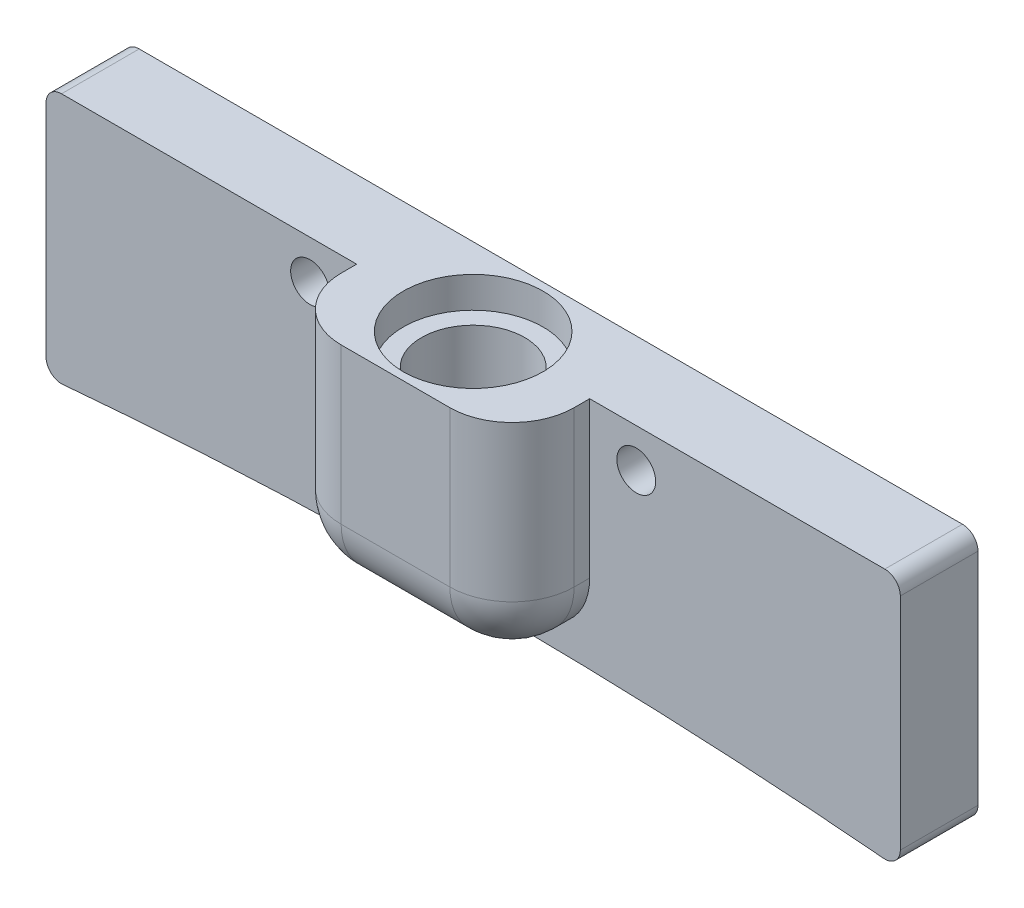
ISO-10303-21;
HEADER;
FILE_DESCRIPTION(('STEP AP214'),'2;1');
FILE_NAME('part.step','',(''),(''),'','','');
FILE_SCHEMA(('AUTOMOTIVE_DESIGN { 1 0 10303 214 1 1 1 1 }'));
ENDSEC;
DATA;
#1=APPLICATION_CONTEXT('core data for automotive mechanical design processes');
#2=APPLICATION_PROTOCOL_DEFINITION('international standard','automotive_design',2000,#1);
#3=PRODUCT_CONTEXT('',#1,'mechanical');
#4=PRODUCT('Part','Part','',(#3));
#5=PRODUCT_RELATED_PRODUCT_CATEGORY('part','',(#4));
#6=PRODUCT_DEFINITION_FORMATION('','',#4);
#7=PRODUCT_DEFINITION_CONTEXT('part definition',#1,'design');
#8=PRODUCT_DEFINITION('design','',#6,#7);
#9=PRODUCT_DEFINITION_SHAPE('','',#8);
#10=(LENGTH_UNIT() NAMED_UNIT(*) SI_UNIT(.MILLI.,.METRE.));
#11=(NAMED_UNIT(*) PLANE_ANGLE_UNIT() SI_UNIT($,.RADIAN.));
#12=(NAMED_UNIT(*) SI_UNIT($,.STERADIAN.) SOLID_ANGLE_UNIT());
#13=UNCERTAINTY_MEASURE_WITH_UNIT(LENGTH_MEASURE(1.E-05),#10,'distance_accuracy_value','');
#14=(GEOMETRIC_REPRESENTATION_CONTEXT(3) GLOBAL_UNCERTAINTY_ASSIGNED_CONTEXT((#13)) GLOBAL_UNIT_ASSIGNED_CONTEXT((#10,
#11,#12)) REPRESENTATION_CONTEXT('',''));
#15=CARTESIAN_POINT('',(0.,0.,0.));
#16=DIRECTION('',(0.,0.,1.));
#17=DIRECTION('',(1.,0.,0.));
#18=AXIS2_PLACEMENT_3D('',#15,#16,#17);
#19=CARTESIAN_POINT('',(-1.09287578986539E-12,-315.000000000012,5.));
#20=DIRECTION('',(0.,0.,-1.));
#21=DIRECTION('',(-1.,0.,0.));
#22=AXIS2_PLACEMENT_3D('',#19,#20,#21);
#23=CYLINDRICAL_SURFACE('',#22,299.999999999988);
#24=CARTESIAN_POINT('',(-1.09287578986539E-12,-315.000000000012,0.));
#25=DIRECTION('',(0.,0.,1.));
#26=DIRECTION('',(1.,0.,0.));
#27=AXIS2_PLACEMENT_3D('',#24,#25,#26);
#28=CIRCLE('',#27,299.999999999988);
#29=CARTESIAN_POINT('',(26.4119601328904,-16.1649144395453,0.));
#30=VERTEX_POINT('',#29);
#31=CARTESIAN_POINT('',(-26.4119602064126,-16.1649144460432,0.));
#32=VERTEX_POINT('',#31);
#33=EDGE_CURVE('E240',#30,#32,#28,.T.);
#34=ORIENTED_EDGE('',*,*,#33,.F.);
#35=DIRECTION('',(0.,0.,-1.));
#36=VECTOR('',#35,1.);
#37=CARTESIAN_POINT('',(26.4119601328904,-16.1649144395453,5.));
#38=LINE('',#37,#36);
#39=CARTESIAN_POINT('',(26.4119601328904,-16.1649144395453,5.));
#40=VERTEX_POINT('',#39);
#41=EDGE_CURVE('E214',#30,#40,#38,.F.);
#42=ORIENTED_EDGE('',*,*,#41,.T.);
#43=CARTESIAN_POINT('',(-1.09287578986539E-12,-315.000000000012,5.));
#44=DIRECTION('',(0.,0.,1.));
#45=DIRECTION('',(1.,0.,0.));
#46=AXIS2_PLACEMENT_3D('',#43,#44,#45);
#47=CIRCLE('',#46,299.999999999988);
#48=CARTESIAN_POINT('',(-26.4119602064126,-16.1649144460432,5.));
#49=VERTEX_POINT('',#48);
#50=EDGE_CURVE('E179',#40,#49,#47,.T.);
#51=ORIENTED_EDGE('',*,*,#50,.T.);
#52=DIRECTION('',(0.,0.,-1.));
#53=VECTOR('',#52,1.);
#54=CARTESIAN_POINT('',(-26.4119602064126,-16.1649144460432,5.));
#55=LINE('',#54,#53);
#56=EDGE_CURVE('E211',#49,#32,#55,.T.);
#57=ORIENTED_EDGE('',*,*,#56,.T.);
#58=EDGE_LOOP('',(#34,#42,#51,#57));
#59=FACE_BOUND('',#58,.T.);
#60=ADVANCED_FACE('F34',(#59),#23,.F.);
#61=CARTESIAN_POINT('',(27.5,0.,5.));
#62=DIRECTION('',(1.,0.,0.));
#63=DIRECTION('',(0.,0.,-1.));
#64=AXIS2_PLACEMENT_3D('',#61,#62,#63);
#65=PLANE('',#64);
#66=DIRECTION('',(0.,-1.,0.));
#67=VECTOR('',#66,1.);
#68=CARTESIAN_POINT('',(27.5,0.,5.));
#69=LINE('',#68,#67);
#70=CARTESIAN_POINT('',(27.5,-1.,5.));
#71=VERTEX_POINT('',#70);
#72=CARTESIAN_POINT('',(27.5,-15.168797487677,5.));
#73=VERTEX_POINT('',#72);
#74=EDGE_CURVE('E200',#71,#73,#69,.T.);
#75=ORIENTED_EDGE('',*,*,#74,.T.);
#76=DIRECTION('',(0.,0.,-1.));
#77=VECTOR('',#76,1.);
#78=CARTESIAN_POINT('',(27.5,-15.168797487677,5.));
#79=LINE('',#78,#77);
#80=CARTESIAN_POINT('',(27.5,-15.168797487677,0.));
#81=VERTEX_POINT('',#80);
#82=EDGE_CURVE('E199',#73,#81,#79,.T.);
#83=ORIENTED_EDGE('',*,*,#82,.T.);
#84=DIRECTION('',(0.,-1.,0.));
#85=VECTOR('',#84,1.);
#86=CARTESIAN_POINT('',(27.5,0.,0.));
#87=LINE('',#86,#85);
#88=CARTESIAN_POINT('',(27.5,-1.,0.));
#89=VERTEX_POINT('',#88);
#90=EDGE_CURVE('E231',#89,#81,#87,.T.);
#91=ORIENTED_EDGE('',*,*,#90,.F.);
#92=DIRECTION('',(0.,0.,-1.));
#93=VECTOR('',#92,1.);
#94=CARTESIAN_POINT('',(27.5,-1.,5.));
#95=LINE('',#94,#93);
#96=EDGE_CURVE('E197',#89,#71,#95,.F.);
#97=ORIENTED_EDGE('',*,*,#96,.T.);
#98=EDGE_LOOP('',(#75,#83,#91,#97));
#99=FACE_BOUND('',#98,.T.);
#100=ADVANCED_FACE('F388',(#99),#65,.T.);
#101=CARTESIAN_POINT('',(-27.5000000737673,0.,5.));
#102=DIRECTION('',(0.,1.,0.));
#103=DIRECTION('',(-1.,0.,0.));
#104=AXIS2_PLACEMENT_3D('',#101,#102,#103);
#105=PLANE('',#104);
#106=CARTESIAN_POINT('',(0.,0.,5.));
#107=DIRECTION('',(0.,1.,0.));
#108=DIRECTION('',(0.,0.,1.));
#109=AXIS2_PLACEMENT_3D('',#106,#107,#108);
#110=CIRCLE('',#109,4.49999999999999);
#111=CARTESIAN_POINT('',(0.,0.,9.49999999999999));
#112=VERTEX_POINT('',#111);
#113=EDGE_CURVE('E276',#112,#112,#110,.T.);
#114=ORIENTED_EDGE('',*,*,#113,.F.);
#115=EDGE_LOOP('',(#114));
#116=FACE_BOUND('',#115,.T.);
#117=DIRECTION('',(-1.,0.,0.));
#118=VECTOR('',#117,1.);
#119=CARTESIAN_POINT('',(-7.5,0.,10.));
#120=LINE('',#119,#118);
#121=CARTESIAN_POINT('',(3.5,0.,10.));
#122=VERTEX_POINT('',#121);
#123=CARTESIAN_POINT('',(-3.5,0.,10.));
#124=VERTEX_POINT('',#123);
#125=EDGE_CURVE('E170',#122,#124,#120,.T.);
#126=ORIENTED_EDGE('',*,*,#125,.F.);
#127=CARTESIAN_POINT('',(3.5,0.,6.));
#128=DIRECTION('',(0.,1.,0.));
#129=DIRECTION('',(-1.,0.,0.));
#130=AXIS2_PLACEMENT_3D('',#127,#128,#129);
#131=CIRCLE('',#130,4.);
#132=CARTESIAN_POINT('',(7.5,0.,6.));
#133=VERTEX_POINT('',#132);
#134=EDGE_CURVE('E252',#122,#133,#131,.T.);
#135=ORIENTED_EDGE('',*,*,#134,.T.);
#136=DIRECTION('',(0.,0.,-1.));
#137=VECTOR('',#136,1.);
#138=CARTESIAN_POINT('',(7.5,0.,10.));
#139=LINE('',#138,#137);
#140=CARTESIAN_POINT('',(7.5,0.,5.));
#141=VERTEX_POINT('',#140);
#142=EDGE_CURVE('E173',#133,#141,#139,.T.);
#143=ORIENTED_EDGE('',*,*,#142,.T.);
#144=DIRECTION('',(1.,0.,0.));
#145=VECTOR('',#144,1.);
#146=CARTESIAN_POINT('',(-27.5000000737673,0.,5.));
#147=LINE('',#146,#145);
#148=CARTESIAN_POINT('',(26.5,0.,5.));
#149=VERTEX_POINT('',#148);
#150=EDGE_CURVE('E221',#141,#149,#147,.T.);
#151=ORIENTED_EDGE('',*,*,#150,.T.);
#152=DIRECTION('',(0.,0.,-1.));
#153=VECTOR('',#152,1.);
#154=CARTESIAN_POINT('',(26.5,0.,5.));
#155=LINE('',#154,#153);
#156=CARTESIAN_POINT('',(26.5,0.,0.));
#157=VERTEX_POINT('',#156);
#158=EDGE_CURVE('E185',#149,#157,#155,.T.);
#159=ORIENTED_EDGE('',*,*,#158,.T.);
#160=DIRECTION('',(1.,0.,0.));
#161=VECTOR('',#160,1.);
#162=CARTESIAN_POINT('',(-27.5000000737673,0.,0.));
#163=LINE('',#162,#161);
#164=CARTESIAN_POINT('',(-26.5000000737673,0.,0.));
#165=VERTEX_POINT('',#164);
#166=EDGE_CURVE('E235',#165,#157,#163,.T.);
#167=ORIENTED_EDGE('',*,*,#166,.F.);
#168=DIRECTION('',(0.,0.,-1.));
#169=VECTOR('',#168,1.);
#170=CARTESIAN_POINT('',(-26.5000000737673,0.,5.));
#171=LINE('',#170,#169);
#172=CARTESIAN_POINT('',(-26.5000000737673,0.,5.));
#173=VERTEX_POINT('',#172);
#174=EDGE_CURVE('E328',#165,#173,#171,.F.);
#175=ORIENTED_EDGE('',*,*,#174,.T.);
#176=CARTESIAN_POINT('',(-7.5,0.,5.));
#177=VERTEX_POINT('',#176);
#178=EDGE_CURVE('E217',#173,#177,#147,.T.);
#179=ORIENTED_EDGE('',*,*,#178,.T.);
#180=DIRECTION('',(0.,0.,-1.));
#181=VECTOR('',#180,1.);
#182=CARTESIAN_POINT('',(-7.5,0.,10.));
#183=LINE('',#182,#181);
#184=CARTESIAN_POINT('',(-7.5,0.,6.));
#185=VERTEX_POINT('',#184);
#186=EDGE_CURVE('E189',#185,#177,#183,.T.);
#187=ORIENTED_EDGE('',*,*,#186,.F.);
#188=CARTESIAN_POINT('',(-3.5,0.,6.));
#189=DIRECTION('',(0.,1.,0.));
#190=DIRECTION('',(-1.,0.,0.));
#191=AXIS2_PLACEMENT_3D('',#188,#189,#190);
#192=CIRCLE('',#191,4.);
#193=EDGE_CURVE('E250',#185,#124,#192,.T.);
#194=ORIENTED_EDGE('',*,*,#193,.T.);
#195=EDGE_LOOP('',(#126,#135,#143,#151,#159,#167,#175,#179,#187,#194));
#196=FACE_BOUND('',#195,.T.);
#197=ADVANCED_FACE('F360',(#116,#196),#105,.T.);
#198=CARTESIAN_POINT('',(-27.5000000737673,-16.2630756067663,5.));
#199=DIRECTION('',(-1.,0.,0.));
#200=DIRECTION('',(0.,0.,1.));
#201=AXIS2_PLACEMENT_3D('',#198,#199,#200);
#202=PLANE('',#201);
#203=DIRECTION('',(0.,1.,0.));
#204=VECTOR('',#203,1.);
#205=CARTESIAN_POINT('',(-27.5000000737673,-16.2630756067663,0.));
#206=LINE('',#205,#204);
#207=CARTESIAN_POINT('',(-27.5000000737673,-15.1687974941966,0.));
#208=VERTEX_POINT('',#207);
#209=CARTESIAN_POINT('',(-27.5000000737673,-0.999999999999994,0.));
#210=VERTEX_POINT('',#209);
#211=EDGE_CURVE('E238',#208,#210,#206,.T.);
#212=ORIENTED_EDGE('',*,*,#211,.F.);
#213=DIRECTION('',(0.,0.,-1.));
#214=VECTOR('',#213,1.);
#215=CARTESIAN_POINT('',(-27.5000000737673,-15.1687974941966,5.));
#216=LINE('',#215,#214);
#217=CARTESIAN_POINT('',(-27.5000000737673,-15.1687974941966,5.));
#218=VERTEX_POINT('',#217);
#219=EDGE_CURVE('E323',#208,#218,#216,.F.);
#220=ORIENTED_EDGE('',*,*,#219,.T.);
#221=DIRECTION('',(0.,1.,0.));
#222=VECTOR('',#221,1.);
#223=CARTESIAN_POINT('',(-27.5000000737673,-16.2630756067663,5.));
#224=LINE('',#223,#222);
#225=CARTESIAN_POINT('',(-27.5000000737673,-0.999999999999994,5.));
#226=VERTEX_POINT('',#225);
#227=EDGE_CURVE('E225',#218,#226,#224,.T.);
#228=ORIENTED_EDGE('',*,*,#227,.T.);
#229=DIRECTION('',(0.,0.,-1.));
#230=VECTOR('',#229,1.);
#231=CARTESIAN_POINT('',(-27.5000000737673,-0.999999999999994,5.));
#232=LINE('',#231,#230);
#233=EDGE_CURVE('E320',#226,#210,#232,.T.);
#234=ORIENTED_EDGE('',*,*,#233,.T.);
#235=EDGE_LOOP('',(#212,#220,#228,#234));
#236=FACE_BOUND('',#235,.T.);
#237=ADVANCED_FACE('F302',(#236),#202,.T.);
#238=CARTESIAN_POINT('',(-1.09287578986539E-12,-315.000000000012,5.));
#239=DIRECTION('',(0.,0.,1.));
#240=DIRECTION('',(1.,0.,0.));
#241=AXIS2_PLACEMENT_3D('',#238,#239,#240);
#242=PLANE('',#241);
#243=CARTESIAN_POINT('',(-10.5,-2.5,5.));
#244=DIRECTION('',(0.,0.,1.));
#245=DIRECTION('',(1.,0.,0.));
#246=AXIS2_PLACEMENT_3D('',#243,#244,#245);
#247=CIRCLE('',#246,1.25);
#248=CARTESIAN_POINT('',(-9.25,-2.5,5.));
#249=VERTEX_POINT('',#248);
#250=EDGE_CURVE('E292',#249,#249,#247,.T.);
#251=ORIENTED_EDGE('',*,*,#250,.F.);
#252=EDGE_LOOP('',(#251));
#253=FACE_BOUND('',#252,.T.);
#254=CARTESIAN_POINT('',(10.5,-2.5,5.));
#255=DIRECTION('',(0.,0.,1.));
#256=DIRECTION('',(1.,0.,0.));
#257=AXIS2_PLACEMENT_3D('',#254,#255,#256);
#258=CIRCLE('',#257,1.25);
#259=CARTESIAN_POINT('',(11.75,-2.5,5.));
#260=VERTEX_POINT('',#259);
#261=EDGE_CURVE('E286',#260,#260,#258,.T.);
#262=ORIENTED_EDGE('',*,*,#261,.F.);
#263=EDGE_LOOP('',(#262));
#264=FACE_BOUND('',#263,.T.);
#265=ORIENTED_EDGE('',*,*,#50,.F.);
#266=CARTESIAN_POINT('',(26.5,-15.168797487677,5.));
#267=DIRECTION('',(0.,0.,1.));
#268=DIRECTION('',(1.,0.,0.));
#269=AXIS2_PLACEMENT_3D('',#266,#267,#268);
#270=CIRCLE('',#269,1.);
#271=EDGE_CURVE('E309',#40,#73,#270,.T.);
#272=ORIENTED_EDGE('',*,*,#271,.T.);
#273=ORIENTED_EDGE('',*,*,#74,.F.);
#274=CARTESIAN_POINT('',(26.5,-1.,5.));
#275=DIRECTION('',(0.,0.,1.));
#276=DIRECTION('',(1.,0.,0.));
#277=AXIS2_PLACEMENT_3D('',#274,#275,#276);
#278=CIRCLE('',#277,1.);
#279=EDGE_CURVE('E325',#71,#149,#278,.T.);
#280=ORIENTED_EDGE('',*,*,#279,.T.);
#281=ORIENTED_EDGE('',*,*,#150,.F.);
#282=DIRECTION('',(0.,1.,0.));
#283=VECTOR('',#282,1.);
#284=CARTESIAN_POINT('',(7.5,0.,5.));
#285=LINE('',#284,#283);
#286=CARTESIAN_POINT('',(7.5,-10.,5.));
#287=VERTEX_POINT('',#286);
#288=EDGE_CURVE('E174',#287,#141,#285,.T.);
#289=ORIENTED_EDGE('',*,*,#288,.F.);
#290=CARTESIAN_POINT('',(3.5,-10.,5.));
#291=DIRECTION('',(0.,0.,1.));
#292=DIRECTION('',(1.,0.,0.));
#293=AXIS2_PLACEMENT_3D('',#290,#291,#292);
#294=CIRCLE('',#293,4.);
#295=CARTESIAN_POINT('',(3.5,-14.,5.));
#296=VERTEX_POINT('',#295);
#297=EDGE_CURVE('E43',#287,#296,#294,.F.);
#298=ORIENTED_EDGE('',*,*,#297,.T.);
#299=DIRECTION('',(1.,0.,0.));
#300=VECTOR('',#299,1.);
#301=CARTESIAN_POINT('',(7.5,-14.,5.));
#302=LINE('',#301,#300);
#303=CARTESIAN_POINT('',(-3.5,-14.,5.));
#304=VERTEX_POINT('',#303);
#305=EDGE_CURVE('E163',#304,#296,#302,.T.);
#306=ORIENTED_EDGE('',*,*,#305,.F.);
#307=CARTESIAN_POINT('',(-3.5,-10.,5.));
#308=DIRECTION('',(0.,0.,1.));
#309=DIRECTION('',(1.,0.,0.));
#310=AXIS2_PLACEMENT_3D('',#307,#308,#309);
#311=CIRCLE('',#310,4.);
#312=CARTESIAN_POINT('',(-7.5,-10.,5.));
#313=VERTEX_POINT('',#312);
#314=EDGE_CURVE('E11',#304,#313,#311,.F.);
#315=ORIENTED_EDGE('',*,*,#314,.T.);
#316=DIRECTION('',(0.,-1.,0.));
#317=VECTOR('',#316,1.);
#318=CARTESIAN_POINT('',(-7.5,-14.,5.));
#319=LINE('',#318,#317);
#320=EDGE_CURVE('E160',#177,#313,#319,.T.);
#321=ORIENTED_EDGE('',*,*,#320,.F.);
#322=ORIENTED_EDGE('',*,*,#178,.F.);
#323=CARTESIAN_POINT('',(-26.5000000737673,-0.999999999999994,5.));
#324=DIRECTION('',(0.,0.,1.));
#325=DIRECTION('',(1.,0.,0.));
#326=AXIS2_PLACEMENT_3D('',#323,#324,#325);
#327=CIRCLE('',#326,1.);
#328=EDGE_CURVE('E216',#173,#226,#327,.T.);
#329=ORIENTED_EDGE('',*,*,#328,.T.);
#330=ORIENTED_EDGE('',*,*,#227,.F.);
#331=CARTESIAN_POINT('',(-26.5000000737673,-15.1687974941966,5.));
#332=DIRECTION('',(0.,0.,1.));
#333=DIRECTION('',(1.,0.,0.));
#334=AXIS2_PLACEMENT_3D('',#331,#332,#333);
#335=CIRCLE('',#334,1.);
#336=EDGE_CURVE('E313',#218,#49,#335,.T.);
#337=ORIENTED_EDGE('',*,*,#336,.T.);
#338=EDGE_LOOP('',(#265,#272,#273,#280,#281,#289,#298,#306,#315,#321,#322,#329,#330,#337));
#339=FACE_BOUND('',#338,.T.);
#340=ADVANCED_FACE('F298',(#253,#264,#339),#242,.T.);
#341=CARTESIAN_POINT('',(-1.09287578986539E-12,-315.000000000012,0.));
#342=DIRECTION('',(0.,0.,1.));
#343=DIRECTION('',(1.,0.,0.));
#344=AXIS2_PLACEMENT_3D('',#341,#342,#343);
#345=PLANE('',#344);
#346=CARTESIAN_POINT('',(-10.5,-2.5,0.));
#347=DIRECTION('',(0.,0.,1.));
#348=DIRECTION('',(1.,0.,0.));
#349=AXIS2_PLACEMENT_3D('',#346,#347,#348);
#350=CIRCLE('',#349,1.25);
#351=CARTESIAN_POINT('',(-9.25,-2.5,0.));
#352=VERTEX_POINT('',#351);
#353=EDGE_CURVE('E289',#352,#352,#350,.T.);
#354=ORIENTED_EDGE('',*,*,#353,.T.);
#355=EDGE_LOOP('',(#354));
#356=FACE_BOUND('',#355,.T.);
#357=CARTESIAN_POINT('',(10.5,-2.5,0.));
#358=DIRECTION('',(0.,0.,1.));
#359=DIRECTION('',(1.,0.,0.));
#360=AXIS2_PLACEMENT_3D('',#357,#358,#359);
#361=CIRCLE('',#360,1.25);
#362=CARTESIAN_POINT('',(11.75,-2.5,0.));
#363=VERTEX_POINT('',#362);
#364=EDGE_CURVE('E262',#363,#363,#361,.T.);
#365=ORIENTED_EDGE('',*,*,#364,.T.);
#366=EDGE_LOOP('',(#365));
#367=FACE_BOUND('',#366,.T.);
#368=ORIENTED_EDGE('',*,*,#90,.T.);
#369=CARTESIAN_POINT('',(26.5,-15.168797487677,0.));
#370=DIRECTION('',(0.,0.,1.));
#371=DIRECTION('',(1.,0.,0.));
#372=AXIS2_PLACEMENT_3D('',#369,#370,#371);
#373=CIRCLE('',#372,1.);
#374=EDGE_CURVE('E209',#81,#30,#373,.F.);
#375=ORIENTED_EDGE('',*,*,#374,.T.);
#376=ORIENTED_EDGE('',*,*,#33,.T.);
#377=CARTESIAN_POINT('',(-26.5000000737673,-15.1687974941966,0.));
#378=DIRECTION('',(0.,0.,1.));
#379=DIRECTION('',(1.,0.,0.));
#380=AXIS2_PLACEMENT_3D('',#377,#378,#379);
#381=CIRCLE('',#380,1.);
#382=EDGE_CURVE('E207',#32,#208,#381,.F.);
#383=ORIENTED_EDGE('',*,*,#382,.T.);
#384=ORIENTED_EDGE('',*,*,#211,.T.);
#385=CARTESIAN_POINT('',(-26.5000000737673,-0.999999999999994,0.));
#386=DIRECTION('',(0.,0.,1.));
#387=DIRECTION('',(1.,0.,0.));
#388=AXIS2_PLACEMENT_3D('',#385,#386,#387);
#389=CIRCLE('',#388,1.);
#390=EDGE_CURVE('E203',#210,#165,#389,.F.);
#391=ORIENTED_EDGE('',*,*,#390,.T.);
#392=ORIENTED_EDGE('',*,*,#166,.T.);
#393=CARTESIAN_POINT('',(26.5,-1.,0.));
#394=DIRECTION('',(0.,0.,1.));
#395=DIRECTION('',(1.,0.,0.));
#396=AXIS2_PLACEMENT_3D('',#393,#394,#395);
#397=CIRCLE('',#396,1.);
#398=EDGE_CURVE('E205',#157,#89,#397,.F.);
#399=ORIENTED_EDGE('',*,*,#398,.T.);
#400=EDGE_LOOP('',(#368,#375,#376,#383,#384,#391,#392,#399));
#401=FACE_BOUND('',#400,.T.);
#402=ADVANCED_FACE('F301',(#356,#367,#401),#345,.F.);
#403=CARTESIAN_POINT('',(-7.5,-14.,10.));
#404=DIRECTION('',(1.,0.,0.));
#405=DIRECTION('',(0.,1.,0.));
#406=AXIS2_PLACEMENT_3D('',#403,#404,#405);
#407=PLANE('',#406);
#408=ORIENTED_EDGE('',*,*,#320,.T.);
#409=DIRECTION('',(0.,0.,-1.));
#410=VECTOR('',#409,1.);
#411=CARTESIAN_POINT('',(-7.5,-10.,10.));
#412=LINE('',#411,#410);
#413=CARTESIAN_POINT('',(-7.5,-10.,6.));
#414=VERTEX_POINT('',#413);
#415=EDGE_CURVE('E51',#313,#414,#412,.F.);
#416=ORIENTED_EDGE('',*,*,#415,.T.);
#417=DIRECTION('',(0.,-1.,0.));
#418=VECTOR('',#417,1.);
#419=CARTESIAN_POINT('',(-7.5,-14.,6.));
#420=LINE('',#419,#418);
#421=EDGE_CURVE('E254',#414,#185,#420,.F.);
#422=ORIENTED_EDGE('',*,*,#421,.T.);
#423=ORIENTED_EDGE('',*,*,#186,.T.);
#424=EDGE_LOOP('',(#408,#416,#422,#423));
#425=FACE_BOUND('',#424,.T.);
#426=ADVANCED_FACE('F553',(#425),#407,.F.);
#427=CARTESIAN_POINT('',(7.5,-14.,10.));
#428=DIRECTION('',(0.,1.,0.));
#429=DIRECTION('',(0.,0.,1.));
#430=AXIS2_PLACEMENT_3D('',#427,#428,#429);
#431=PLANE('',#430);
#432=ORIENTED_EDGE('',*,*,#305,.T.);
#433=DIRECTION('',(0.,0.,-1.));
#434=VECTOR('',#433,1.);
#435=CARTESIAN_POINT('',(3.5,-14.,10.));
#436=LINE('',#435,#434);
#437=CARTESIAN_POINT('',(3.5,-14.,6.));
#438=VERTEX_POINT('',#437);
#439=EDGE_CURVE('E348',#296,#438,#436,.F.);
#440=ORIENTED_EDGE('',*,*,#439,.T.);
#441=DIRECTION('',(1.,0.,0.));
#442=VECTOR('',#441,1.);
#443=CARTESIAN_POINT('',(7.5,-14.,6.));
#444=LINE('',#443,#442);
#445=CARTESIAN_POINT('',(-3.5,-14.,6.));
#446=VERTEX_POINT('',#445);
#447=EDGE_CURVE('E341',#438,#446,#444,.F.);
#448=ORIENTED_EDGE('',*,*,#447,.T.);
#449=DIRECTION('',(0.,0.,-1.));
#450=VECTOR('',#449,1.);
#451=CARTESIAN_POINT('',(-3.5,-14.,10.));
#452=LINE('',#451,#450);
#453=EDGE_CURVE('E344',#446,#304,#452,.T.);
#454=ORIENTED_EDGE('',*,*,#453,.T.);
#455=EDGE_LOOP('',(#432,#440,#448,#454));
#456=FACE_BOUND('',#455,.T.);
#457=ADVANCED_FACE('F371',(#456),#431,.F.);
#458=CARTESIAN_POINT('',(7.5,0.,10.));
#459=DIRECTION('',(-1.,0.,0.));
#460=DIRECTION('',(0.,0.,1.));
#461=AXIS2_PLACEMENT_3D('',#458,#459,#460);
#462=PLANE('',#461);
#463=DIRECTION('',(0.,1.,0.));
#464=VECTOR('',#463,1.);
#465=CARTESIAN_POINT('',(7.5,0.,6.));
#466=LINE('',#465,#464);
#467=CARTESIAN_POINT('',(7.5,-10.,6.));
#468=VERTEX_POINT('',#467);
#469=EDGE_CURVE('E190',#133,#468,#466,.F.);
#470=ORIENTED_EDGE('',*,*,#469,.T.);
#471=DIRECTION('',(0.,0.,-1.));
#472=VECTOR('',#471,1.);
#473=CARTESIAN_POINT('',(7.5,-10.,10.));
#474=LINE('',#473,#472);
#475=EDGE_CURVE('E335',#468,#287,#474,.T.);
#476=ORIENTED_EDGE('',*,*,#475,.T.);
#477=ORIENTED_EDGE('',*,*,#288,.T.);
#478=ORIENTED_EDGE('',*,*,#142,.F.);
#479=EDGE_LOOP('',(#470,#476,#477,#478));
#480=FACE_BOUND('',#479,.T.);
#481=ADVANCED_FACE('F538',(#480),#462,.F.);
#482=CARTESIAN_POINT('',(0.,0.,10.));
#483=DIRECTION('',(0.,0.,-1.));
#484=DIRECTION('',(-1.,0.,0.));
#485=AXIS2_PLACEMENT_3D('',#482,#483,#484);
#486=PLANE('',#485);
#487=DIRECTION('',(1.,0.,0.));
#488=VECTOR('',#487,1.);
#489=CARTESIAN_POINT('',(0.,-10.,10.));
#490=LINE('',#489,#488);
#491=CARTESIAN_POINT('',(-3.5,-10.,10.));
#492=VERTEX_POINT('',#491);
#493=CARTESIAN_POINT('',(3.5,-10.,10.));
#494=VERTEX_POINT('',#493);
#495=EDGE_CURVE('E351',#492,#494,#490,.T.);
#496=ORIENTED_EDGE('',*,*,#495,.T.);
#497=DIRECTION('',(0.,1.,0.));
#498=VECTOR('',#497,1.);
#499=CARTESIAN_POINT('',(3.5,0.,10.));
#500=LINE('',#499,#498);
#501=EDGE_CURVE('E248',#494,#122,#500,.T.);
#502=ORIENTED_EDGE('',*,*,#501,.T.);
#503=ORIENTED_EDGE('',*,*,#125,.T.);
#504=DIRECTION('',(0.,-1.,0.));
#505=VECTOR('',#504,1.);
#506=CARTESIAN_POINT('',(-3.5,0.,10.));
#507=LINE('',#506,#505);
#508=EDGE_CURVE('E350',#124,#492,#507,.T.);
#509=ORIENTED_EDGE('',*,*,#508,.T.);
#510=EDGE_LOOP('',(#496,#502,#503,#509));
#511=FACE_BOUND('',#510,.T.);
#512=ADVANCED_FACE('F154',(#511),#486,.F.);
#513=CARTESIAN_POINT('',(0.,-9.99999999999999,5.));
#514=DIRECTION('',(0.,1.,0.));
#515=DIRECTION('',(0.,0.,1.));
#516=AXIS2_PLACEMENT_3D('',#513,#514,#515);
#517=CONICAL_SURFACE('',#516,3.3235,1.0297442587514);
#518=CARTESIAN_POINT('',(0.,-11.996960267,5.));
#519=VERTEX_POINT('',#518);
#520=VERTEX_LOOP('',#519);
#521=FACE_BOUND('',#520,.T.);
#522=CARTESIAN_POINT('',(0.,-9.99999999999999,5.));
#523=DIRECTION('',(0.,1.,0.));
#524=DIRECTION('',(0.,0.,1.));
#525=AXIS2_PLACEMENT_3D('',#522,#523,#524);
#526=CIRCLE('',#525,3.3235);
#527=CARTESIAN_POINT('',(0.,-9.99999999999999,8.3235));
#528=VERTEX_POINT('',#527);
#529=EDGE_CURVE('E158',#528,#528,#526,.T.);
#530=ORIENTED_EDGE('',*,*,#529,.T.);
#531=EDGE_LOOP('',(#530));
#532=FACE_BOUND('',#531,.T.);
#533=ADVANCED_FACE('F150',(#521,#532),#517,.F.);
#534=CARTESIAN_POINT('',(0.,0.,5.));
#535=DIRECTION('',(0.,1.,0.));
#536=DIRECTION('',(0.,0.,1.));
#537=AXIS2_PLACEMENT_3D('',#534,#535,#536);
#538=CYLINDRICAL_SURFACE('',#537,3.3235);
#539=ORIENTED_EDGE('',*,*,#529,.F.);
#540=EDGE_LOOP('',(#539));
#541=FACE_BOUND('',#540,.T.);
#542=CARTESIAN_POINT('',(0.,-2.,5.));
#543=DIRECTION('',(0.,1.,0.));
#544=DIRECTION('',(0.,0.,1.));
#545=AXIS2_PLACEMENT_3D('',#542,#543,#544);
#546=CIRCLE('',#545,3.3235);
#547=CARTESIAN_POINT('',(0.,-2.,8.3235));
#548=VERTEX_POINT('',#547);
#549=EDGE_CURVE('E161',#548,#548,#546,.T.);
#550=ORIENTED_EDGE('',*,*,#549,.T.);
#551=EDGE_LOOP('',(#550));
#552=FACE_BOUND('',#551,.T.);
#553=ADVANCED_FACE('F153',(#541,#552),#538,.F.);
#554=CARTESIAN_POINT('',(3.3235,-2.,5.));
#555=DIRECTION('',(0.,-1.,0.));
#556=DIRECTION('',(0.,0.,-1.));
#557=AXIS2_PLACEMENT_3D('',#554,#555,#556);
#558=PLANE('',#557);
#559=ORIENTED_EDGE('',*,*,#549,.F.);
#560=EDGE_LOOP('',(#559));
#561=FACE_BOUND('',#560,.T.);
#562=CARTESIAN_POINT('',(0.,-2.,5.));
#563=DIRECTION('',(0.,1.,0.));
#564=DIRECTION('',(0.,0.,1.));
#565=AXIS2_PLACEMENT_3D('',#562,#563,#564);
#566=CIRCLE('',#565,4.49999999999999);
#567=CARTESIAN_POINT('',(0.,-2.,9.49999999999999));
#568=VERTEX_POINT('',#567);
#569=EDGE_CURVE('E166',#568,#568,#566,.T.);
#570=ORIENTED_EDGE('',*,*,#569,.T.);
#571=EDGE_LOOP('',(#570));
#572=FACE_BOUND('',#571,.T.);
#573=ADVANCED_FACE('F509',(#561,#572),#558,.F.);
#574=CARTESIAN_POINT('',(0.,0.,5.));
#575=DIRECTION('',(0.,1.,0.));
#576=DIRECTION('',(0.,0.,1.));
#577=AXIS2_PLACEMENT_3D('',#574,#575,#576);
#578=CYLINDRICAL_SURFACE('',#577,4.49999999999999);
#579=ORIENTED_EDGE('',*,*,#569,.F.);
#580=EDGE_LOOP('',(#579));
#581=FACE_BOUND('',#580,.T.);
#582=ORIENTED_EDGE('',*,*,#113,.T.);
#583=EDGE_LOOP('',(#582));
#584=FACE_BOUND('',#583,.T.);
#585=ADVANCED_FACE('F401',(#581,#584),#578,.F.);
#586=CARTESIAN_POINT('',(26.5,-15.168797487677,5.));
#587=DIRECTION('',(0.,0.,-1.));
#588=DIRECTION('',(-1.,0.,0.));
#589=AXIS2_PLACEMENT_3D('',#586,#587,#588);
#590=CYLINDRICAL_SURFACE('',#589,1.);
#591=ORIENTED_EDGE('',*,*,#271,.F.);
#592=ORIENTED_EDGE('',*,*,#41,.F.);
#593=ORIENTED_EDGE('',*,*,#374,.F.);
#594=ORIENTED_EDGE('',*,*,#82,.F.);
#595=EDGE_LOOP('',(#591,#592,#593,#594));
#596=FACE_BOUND('',#595,.T.);
#597=ADVANCED_FACE('F319',(#596),#590,.T.);
#598=CARTESIAN_POINT('',(-26.5000000737673,-15.1687974941966,5.));
#599=DIRECTION('',(0.,0.,-1.));
#600=DIRECTION('',(-1.,0.,0.));
#601=AXIS2_PLACEMENT_3D('',#598,#599,#600);
#602=CYLINDRICAL_SURFACE('',#601,1.);
#603=ORIENTED_EDGE('',*,*,#336,.F.);
#604=ORIENTED_EDGE('',*,*,#219,.F.);
#605=ORIENTED_EDGE('',*,*,#382,.F.);
#606=ORIENTED_EDGE('',*,*,#56,.F.);
#607=EDGE_LOOP('',(#603,#604,#605,#606));
#608=FACE_BOUND('',#607,.T.);
#609=ADVANCED_FACE('F400',(#608),#602,.T.);
#610=CARTESIAN_POINT('',(26.5,-1.,5.));
#611=DIRECTION('',(0.,0.,-1.));
#612=DIRECTION('',(-1.,0.,0.));
#613=AXIS2_PLACEMENT_3D('',#610,#611,#612);
#614=CYLINDRICAL_SURFACE('',#613,1.);
#615=ORIENTED_EDGE('',*,*,#279,.F.);
#616=ORIENTED_EDGE('',*,*,#96,.F.);
#617=ORIENTED_EDGE('',*,*,#398,.F.);
#618=ORIENTED_EDGE('',*,*,#158,.F.);
#619=EDGE_LOOP('',(#615,#616,#617,#618));
#620=FACE_BOUND('',#619,.T.);
#621=ADVANCED_FACE('F384',(#620),#614,.T.);
#622=CARTESIAN_POINT('',(-26.5000000737673,-0.999999999999994,5.));
#623=DIRECTION('',(0.,0.,-1.));
#624=DIRECTION('',(-1.,0.,0.));
#625=AXIS2_PLACEMENT_3D('',#622,#623,#624);
#626=CYLINDRICAL_SURFACE('',#625,1.);
#627=ORIENTED_EDGE('',*,*,#328,.F.);
#628=ORIENTED_EDGE('',*,*,#174,.F.);
#629=ORIENTED_EDGE('',*,*,#390,.F.);
#630=ORIENTED_EDGE('',*,*,#233,.F.);
#631=EDGE_LOOP('',(#627,#628,#629,#630));
#632=FACE_BOUND('',#631,.T.);
#633=ADVANCED_FACE('F377',(#632),#626,.T.);
#634=CARTESIAN_POINT('',(-3.5,-10.,10.));
#635=DIRECTION('',(0.,0.,-1.));
#636=DIRECTION('',(-1.,0.,0.));
#637=AXIS2_PLACEMENT_3D('',#634,#635,#636);
#638=CYLINDRICAL_SURFACE('',#637,4.);
#639=ORIENTED_EDGE('',*,*,#314,.F.);
#640=ORIENTED_EDGE('',*,*,#453,.F.);
#641=CARTESIAN_POINT('',(-3.5,-10.,6.));
#642=DIRECTION('',(0.,0.,1.));
#643=DIRECTION('',(1.,0.,0.));
#644=AXIS2_PLACEMENT_3D('',#641,#642,#643);
#645=CIRCLE('',#644,4.);
#646=EDGE_CURVE('E38',#414,#446,#645,.T.);
#647=ORIENTED_EDGE('',*,*,#646,.F.);
#648=ORIENTED_EDGE('',*,*,#415,.F.);
#649=EDGE_LOOP('',(#639,#640,#647,#648));
#650=FACE_BOUND('',#649,.T.);
#651=ADVANCED_FACE('F36',(#650),#638,.T.);
#652=CARTESIAN_POINT('',(-3.5,0.,6.));
#653=DIRECTION('',(0.,-1.,0.));
#654=DIRECTION('',(1.,0.,0.));
#655=AXIS2_PLACEMENT_3D('',#652,#653,#654);
#656=CYLINDRICAL_SURFACE('',#655,4.);
#657=ORIENTED_EDGE('',*,*,#193,.F.);
#658=ORIENTED_EDGE('',*,*,#421,.F.);
#659=CARTESIAN_POINT('',(-3.5,-10.,6.));
#660=DIRECTION('',(0.,-1.,0.));
#661=DIRECTION('',(0.,0.,-1.));
#662=AXIS2_PLACEMENT_3D('',#659,#660,#661);
#663=CIRCLE('',#662,4.);
#664=EDGE_CURVE('E270',#492,#414,#663,.T.);
#665=ORIENTED_EDGE('',*,*,#664,.F.);
#666=ORIENTED_EDGE('',*,*,#508,.F.);
#667=EDGE_LOOP('',(#657,#658,#665,#666));
#668=FACE_BOUND('',#667,.T.);
#669=ADVANCED_FACE('F376',(#668),#656,.T.);
#670=CARTESIAN_POINT('',(-3.5,-10.,6.));
#671=DIRECTION('',(0.,0.,1.));
#672=DIRECTION('',(1.,0.,0.));
#673=AXIS2_PLACEMENT_3D('',#670,#671,#672);
#674=SPHERICAL_SURFACE('',#673,4.);
#675=ORIENTED_EDGE('',*,*,#664,.T.);
#676=ORIENTED_EDGE('',*,*,#646,.T.);
#677=CARTESIAN_POINT('',(-3.5,-10.,6.));
#678=DIRECTION('',(-1.,0.,0.));
#679=DIRECTION('',(0.,0.,1.));
#680=AXIS2_PLACEMENT_3D('',#677,#678,#679);
#681=CIRCLE('',#680,4.);
#682=EDGE_CURVE('E268',#492,#446,#681,.F.);
#683=ORIENTED_EDGE('',*,*,#682,.F.);
#684=EDGE_LOOP('',(#675,#676,#683));
#685=FACE_BOUND('',#684,.T.);
#686=ADVANCED_FACE('F382',(#685),#674,.T.);
#687=CARTESIAN_POINT('',(0.,-10.,6.));
#688=DIRECTION('',(1.,0.,0.));
#689=DIRECTION('',(0.,0.,-1.));
#690=AXIS2_PLACEMENT_3D('',#687,#688,#689);
#691=CYLINDRICAL_SURFACE('',#690,4.);
#692=ORIENTED_EDGE('',*,*,#682,.T.);
#693=ORIENTED_EDGE('',*,*,#447,.F.);
#694=CARTESIAN_POINT('',(3.5,-10.,6.));
#695=DIRECTION('',(1.,0.,0.));
#696=DIRECTION('',(0.,0.,-1.));
#697=AXIS2_PLACEMENT_3D('',#694,#695,#696);
#698=CIRCLE('',#697,4.);
#699=EDGE_CURVE('E265',#494,#438,#698,.T.);
#700=ORIENTED_EDGE('',*,*,#699,.F.);
#701=ORIENTED_EDGE('',*,*,#495,.F.);
#702=EDGE_LOOP('',(#692,#693,#700,#701));
#703=FACE_BOUND('',#702,.T.);
#704=ADVANCED_FACE('F415',(#703),#691,.T.);
#705=CARTESIAN_POINT('',(3.5,0.,6.));
#706=DIRECTION('',(0.,1.,0.));
#707=DIRECTION('',(0.,0.,1.));
#708=AXIS2_PLACEMENT_3D('',#705,#706,#707);
#709=CYLINDRICAL_SURFACE('',#708,4.);
#710=ORIENTED_EDGE('',*,*,#134,.F.);
#711=ORIENTED_EDGE('',*,*,#501,.F.);
#712=CARTESIAN_POINT('',(3.5,-10.,6.));
#713=DIRECTION('',(0.,-1.,0.));
#714=DIRECTION('',(0.,0.,-1.));
#715=AXIS2_PLACEMENT_3D('',#712,#713,#714);
#716=CIRCLE('',#715,4.);
#717=EDGE_CURVE('E261',#468,#494,#716,.T.);
#718=ORIENTED_EDGE('',*,*,#717,.F.);
#719=ORIENTED_EDGE('',*,*,#469,.F.);
#720=EDGE_LOOP('',(#710,#711,#718,#719));
#721=FACE_BOUND('',#720,.T.);
#722=ADVANCED_FACE('F362',(#721),#709,.T.);
#723=CARTESIAN_POINT('',(3.5,-10.,6.));
#724=DIRECTION('',(0.,0.,1.));
#725=DIRECTION('',(1.,0.,0.));
#726=AXIS2_PLACEMENT_3D('',#723,#724,#725);
#727=SPHERICAL_SURFACE('',#726,4.);
#728=ORIENTED_EDGE('',*,*,#717,.T.);
#729=ORIENTED_EDGE('',*,*,#699,.T.);
#730=CARTESIAN_POINT('',(3.5,-10.,6.));
#731=DIRECTION('',(0.,0.,1.));
#732=DIRECTION('',(1.,0.,0.));
#733=AXIS2_PLACEMENT_3D('',#730,#731,#732);
#734=CIRCLE('',#733,4.);
#735=EDGE_CURVE('E258',#468,#438,#734,.F.);
#736=ORIENTED_EDGE('',*,*,#735,.F.);
#737=EDGE_LOOP('',(#728,#729,#736));
#738=FACE_BOUND('',#737,.T.);
#739=ADVANCED_FACE('F365',(#738),#727,.T.);
#740=CARTESIAN_POINT('',(3.5,-10.,10.));
#741=DIRECTION('',(0.,0.,-1.));
#742=DIRECTION('',(-1.,0.,0.));
#743=AXIS2_PLACEMENT_3D('',#740,#741,#742);
#744=CYLINDRICAL_SURFACE('',#743,4.);
#745=ORIENTED_EDGE('',*,*,#735,.T.);
#746=ORIENTED_EDGE('',*,*,#439,.F.);
#747=ORIENTED_EDGE('',*,*,#297,.F.);
#748=ORIENTED_EDGE('',*,*,#475,.F.);
#749=EDGE_LOOP('',(#745,#746,#747,#748));
#750=FACE_BOUND('',#749,.T.);
#751=ADVANCED_FACE('F368',(#750),#744,.T.);
#752=CARTESIAN_POINT('',(10.5,-2.5,5.));
#753=DIRECTION('',(0.,0.,1.));
#754=DIRECTION('',(1.,0.,0.));
#755=AXIS2_PLACEMENT_3D('',#752,#753,#754);
#756=CYLINDRICAL_SURFACE('',#755,1.25);
#757=ORIENTED_EDGE('',*,*,#364,.F.);
#758=EDGE_LOOP('',(#757));
#759=FACE_BOUND('',#758,.T.);
#760=ORIENTED_EDGE('',*,*,#261,.T.);
#761=EDGE_LOOP('',(#760));
#762=FACE_BOUND('',#761,.T.);
#763=ADVANCED_FACE('F410',(#759,#762),#756,.F.);
#764=CARTESIAN_POINT('',(-10.5,-2.5,5.));
#765=DIRECTION('',(0.,0.,1.));
#766=DIRECTION('',(1.,0.,0.));
#767=AXIS2_PLACEMENT_3D('',#764,#765,#766);
#768=CYLINDRICAL_SURFACE('',#767,1.25);
#769=ORIENTED_EDGE('',*,*,#353,.F.);
#770=EDGE_LOOP('',(#769));
#771=FACE_BOUND('',#770,.T.);
#772=ORIENTED_EDGE('',*,*,#250,.T.);
#773=EDGE_LOOP('',(#772));
#774=FACE_BOUND('',#773,.T.);
#775=ADVANCED_FACE('F296',(#771,#774),#768,.F.);
#776=CLOSED_SHELL('',(#60,#100,#197,#237,#340,#402,#426,#457,#481,#512,#533,#553,#573,#585,#597,
#609,#621,#633,#651,#669,#686,#704,#722,#739,#751,#763,#775));
#777=MANIFOLD_SOLID_BREP('B2',#776);
#778=ADVANCED_BREP_SHAPE_REPRESENTATION('',(#18,#777),#14);
#779=SHAPE_DEFINITION_REPRESENTATION(#9,#778);
ENDSEC;
END-ISO-10303-21;
